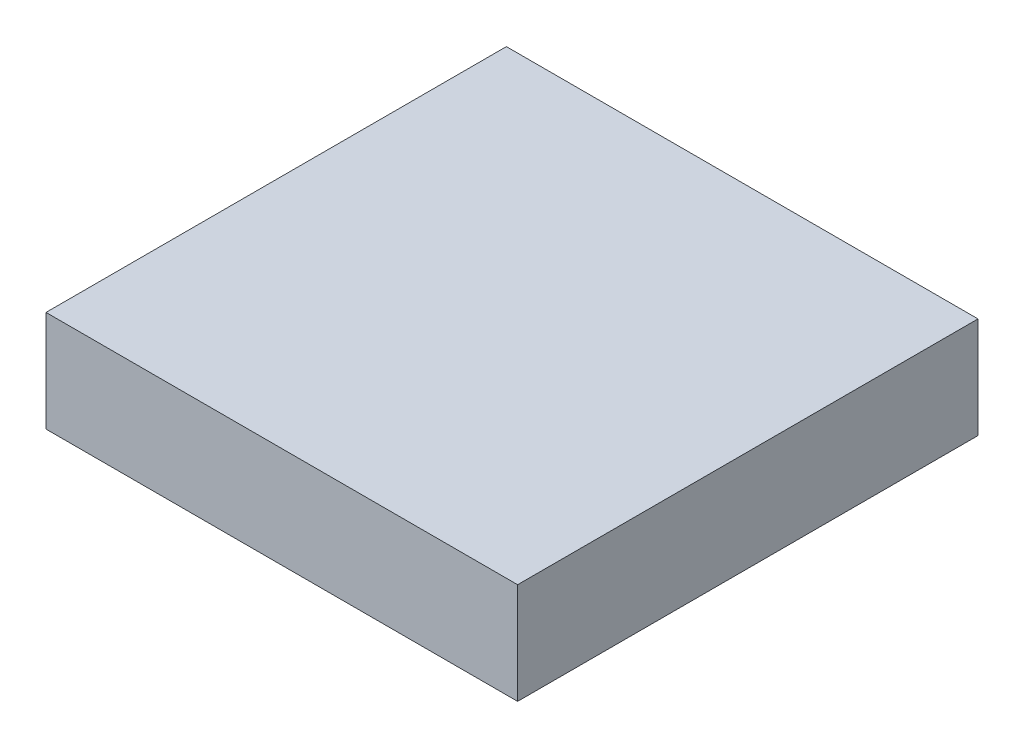
ISO-10303-21;
HEADER;
FILE_DESCRIPTION(('STEP AP214'),'2;1');
FILE_NAME('part.step','',(''),(''),'','','');
FILE_SCHEMA(('AUTOMOTIVE_DESIGN { 1 0 10303 214 1 1 1 1 }'));
ENDSEC;
DATA;
#1=APPLICATION_CONTEXT('core data for automotive mechanical design processes');
#2=APPLICATION_PROTOCOL_DEFINITION('international standard','automotive_design',2000,#1);
#3=PRODUCT_CONTEXT('',#1,'mechanical');
#4=PRODUCT('Part','Part','',(#3));
#5=PRODUCT_RELATED_PRODUCT_CATEGORY('part','',(#4));
#6=PRODUCT_DEFINITION_FORMATION('','',#4);
#7=PRODUCT_DEFINITION_CONTEXT('part definition',#1,'design');
#8=PRODUCT_DEFINITION('design','',#6,#7);
#9=PRODUCT_DEFINITION_SHAPE('','',#8);
#10=(LENGTH_UNIT() NAMED_UNIT(*) SI_UNIT(.MILLI.,.METRE.));
#11=(NAMED_UNIT(*) PLANE_ANGLE_UNIT() SI_UNIT($,.RADIAN.));
#12=(NAMED_UNIT(*) SI_UNIT($,.STERADIAN.) SOLID_ANGLE_UNIT());
#13=UNCERTAINTY_MEASURE_WITH_UNIT(LENGTH_MEASURE(1.E-05),#10,'distance_accuracy_value','');
#14=(GEOMETRIC_REPRESENTATION_CONTEXT(3) GLOBAL_UNCERTAINTY_ASSIGNED_CONTEXT((#13)) GLOBAL_UNIT_ASSIGNED_CONTEXT((#10,
#11,#12)) REPRESENTATION_CONTEXT('',''));
#15=CARTESIAN_POINT('',(0.,0.,0.));
#16=DIRECTION('',(0.,0.,1.));
#17=DIRECTION('',(1.,0.,0.));
#18=AXIS2_PLACEMENT_3D('',#15,#16,#17);
#19=CARTESIAN_POINT('',(53.34,22.86,-52.07));
#20=DIRECTION('',(-1.,0.,0.));
#21=DIRECTION('',(0.,0.,1.));
#22=AXIS2_PLACEMENT_3D('',#19,#20,#21);
#23=PLANE('',#22);
#24=DIRECTION('',(0.,0.,-1.));
#25=VECTOR('',#24,1.);
#26=CARTESIAN_POINT('',(53.34,0.,-52.07));
#27=LINE('',#26,#25);
#28=CARTESIAN_POINT('',(53.34,0.,52.07));
#29=VERTEX_POINT('',#28);
#30=CARTESIAN_POINT('',(53.34,0.,-52.07));
#31=VERTEX_POINT('',#30);
#32=EDGE_CURVE('E107',#29,#31,#27,.T.);
#33=ORIENTED_EDGE('',*,*,#32,.T.);
#34=DIRECTION('',(0.,-1.,0.));
#35=VECTOR('',#34,1.);
#36=CARTESIAN_POINT('',(53.34,22.86,-52.07));
#37=LINE('',#36,#35);
#38=CARTESIAN_POINT('',(53.34,22.86,-52.07));
#39=VERTEX_POINT('',#38);
#40=EDGE_CURVE('E11',#39,#31,#37,.T.);
#41=ORIENTED_EDGE('',*,*,#40,.F.);
#42=DIRECTION('',(0.,0.,-1.));
#43=VECTOR('',#42,1.);
#44=CARTESIAN_POINT('',(53.34,22.86,-52.07));
#45=LINE('',#44,#43);
#46=CARTESIAN_POINT('',(53.34,22.86,52.07));
#47=VERTEX_POINT('',#46);
#48=EDGE_CURVE('E91',#47,#39,#45,.T.);
#49=ORIENTED_EDGE('',*,*,#48,.F.);
#50=DIRECTION('',(0.,-1.,0.));
#51=VECTOR('',#50,1.);
#52=CARTESIAN_POINT('',(53.34,22.86,52.07));
#53=LINE('',#52,#51);
#54=EDGE_CURVE('E103',#47,#29,#53,.T.);
#55=ORIENTED_EDGE('',*,*,#54,.T.);
#56=EDGE_LOOP('',(#33,#41,#49,#55));
#57=FACE_BOUND('',#56,.T.);
#58=ADVANCED_FACE('F39',(#57),#23,.F.);
#59=CARTESIAN_POINT('',(-53.34,22.86,-52.07));
#60=DIRECTION('',(0.,0.,1.));
#61=DIRECTION('',(1.,0.,0.));
#62=AXIS2_PLACEMENT_3D('',#59,#60,#61);
#63=PLANE('',#62);
#64=DIRECTION('',(-1.,0.,0.));
#65=VECTOR('',#64,1.);
#66=CARTESIAN_POINT('',(-53.34,0.,-52.07));
#67=LINE('',#66,#65);
#68=CARTESIAN_POINT('',(-53.34,0.,-52.07));
#69=VERTEX_POINT('',#68);
#70=EDGE_CURVE('E96',#31,#69,#67,.T.);
#71=ORIENTED_EDGE('',*,*,#70,.T.);
#72=DIRECTION('',(0.,-1.,0.));
#73=VECTOR('',#72,1.);
#74=CARTESIAN_POINT('',(-53.34,22.86,-52.07));
#75=LINE('',#74,#73);
#76=CARTESIAN_POINT('',(-53.34,22.86,-52.07));
#77=VERTEX_POINT('',#76);
#78=EDGE_CURVE('E48',#77,#69,#75,.T.);
#79=ORIENTED_EDGE('',*,*,#78,.F.);
#80=DIRECTION('',(-1.,0.,0.));
#81=VECTOR('',#80,1.);
#82=CARTESIAN_POINT('',(-53.34,22.86,-52.07));
#83=LINE('',#82,#81);
#84=EDGE_CURVE('E86',#39,#77,#83,.T.);
#85=ORIENTED_EDGE('',*,*,#84,.F.);
#86=ORIENTED_EDGE('',*,*,#40,.T.);
#87=EDGE_LOOP('',(#71,#79,#85,#86));
#88=FACE_BOUND('',#87,.T.);
#89=ADVANCED_FACE('F95',(#88),#63,.F.);
#90=CARTESIAN_POINT('',(-53.34,22.86,-52.07));
#91=DIRECTION('',(1.,0.,0.));
#92=DIRECTION('',(0.,0.,-1.));
#93=AXIS2_PLACEMENT_3D('',#90,#91,#92);
#94=PLANE('',#93);
#95=DIRECTION('',(0.,0.,1.));
#96=VECTOR('',#95,1.);
#97=CARTESIAN_POINT('',(-53.34,0.,-52.07));
#98=LINE('',#97,#96);
#99=CARTESIAN_POINT('',(-53.34,0.,52.07));
#100=VERTEX_POINT('',#99);
#101=EDGE_CURVE('E73',#69,#100,#98,.T.);
#102=ORIENTED_EDGE('',*,*,#101,.T.);
#103=DIRECTION('',(0.,-1.,0.));
#104=VECTOR('',#103,1.);
#105=CARTESIAN_POINT('',(-53.34,22.86,52.07));
#106=LINE('',#105,#104);
#107=CARTESIAN_POINT('',(-53.34,22.86,52.07));
#108=VERTEX_POINT('',#107);
#109=EDGE_CURVE('E98',#108,#100,#106,.T.);
#110=ORIENTED_EDGE('',*,*,#109,.F.);
#111=DIRECTION('',(0.,0.,1.));
#112=VECTOR('',#111,1.);
#113=CARTESIAN_POINT('',(-53.34,22.86,-52.07));
#114=LINE('',#113,#112);
#115=EDGE_CURVE('E89',#77,#108,#114,.T.);
#116=ORIENTED_EDGE('',*,*,#115,.F.);
#117=ORIENTED_EDGE('',*,*,#78,.T.);
#118=EDGE_LOOP('',(#102,#110,#116,#117));
#119=FACE_BOUND('',#118,.T.);
#120=ADVANCED_FACE('F99',(#119),#94,.F.);
#121=CARTESIAN_POINT('',(-53.34,22.86,52.07));
#122=DIRECTION('',(0.,0.,-1.));
#123=DIRECTION('',(-1.,0.,0.));
#124=AXIS2_PLACEMENT_3D('',#121,#122,#123);
#125=PLANE('',#124);
#126=DIRECTION('',(1.,0.,0.));
#127=VECTOR('',#126,1.);
#128=CARTESIAN_POINT('',(-53.34,0.,52.07));
#129=LINE('',#128,#127);
#130=EDGE_CURVE('E79',#100,#29,#129,.T.);
#131=ORIENTED_EDGE('',*,*,#130,.T.);
#132=ORIENTED_EDGE('',*,*,#54,.F.);
#133=DIRECTION('',(1.,0.,0.));
#134=VECTOR('',#133,1.);
#135=CARTESIAN_POINT('',(-53.34,22.86,52.07));
#136=LINE('',#135,#134);
#137=EDGE_CURVE('E56',#108,#47,#136,.T.);
#138=ORIENTED_EDGE('',*,*,#137,.F.);
#139=ORIENTED_EDGE('',*,*,#109,.T.);
#140=EDGE_LOOP('',(#131,#132,#138,#139));
#141=FACE_BOUND('',#140,.T.);
#142=ADVANCED_FACE('F120',(#141),#125,.F.);
#143=CARTESIAN_POINT('',(0.,22.86,0.));
#144=DIRECTION('',(0.,1.,0.));
#145=DIRECTION('',(0.,0.,1.));
#146=AXIS2_PLACEMENT_3D('',#143,#144,#145);
#147=PLANE('',#146);
#148=ORIENTED_EDGE('',*,*,#48,.T.);
#149=ORIENTED_EDGE('',*,*,#84,.T.);
#150=ORIENTED_EDGE('',*,*,#115,.T.);
#151=ORIENTED_EDGE('',*,*,#137,.T.);
#152=EDGE_LOOP('',(#148,#149,#150,#151));
#153=FACE_BOUND('',#152,.T.);
#154=ADVANCED_FACE('F87',(#153),#147,.T.);
#155=CARTESIAN_POINT('',(0.,0.,0.));
#156=DIRECTION('',(0.,1.,0.));
#157=DIRECTION('',(0.,0.,1.));
#158=AXIS2_PLACEMENT_3D('',#155,#156,#157);
#159=PLANE('',#158);
#160=ORIENTED_EDGE('',*,*,#32,.F.);
#161=ORIENTED_EDGE('',*,*,#130,.F.);
#162=ORIENTED_EDGE('',*,*,#101,.F.);
#163=ORIENTED_EDGE('',*,*,#70,.F.);
#164=EDGE_LOOP('',(#160,#161,#162,#163));
#165=FACE_BOUND('',#164,.T.);
#166=ADVANCED_FACE('F123',(#165),#159,.F.);
#167=CLOSED_SHELL('',(#58,#89,#120,#142,#154,#166));
#168=MANIFOLD_SOLID_BREP('B2',#167);
#169=ADVANCED_BREP_SHAPE_REPRESENTATION('',(#18,#168),#14);
#170=SHAPE_DEFINITION_REPRESENTATION(#9,#169);
ENDSEC;
END-ISO-10303-21;
